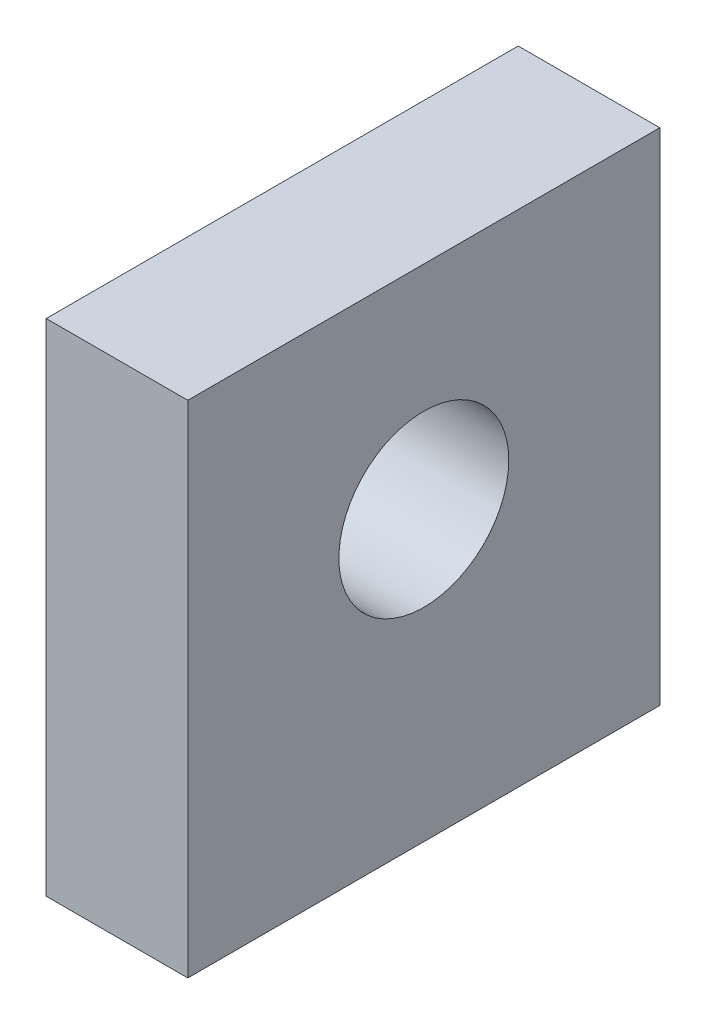
ISO-10303-21;
HEADER;
FILE_DESCRIPTION(('STEP AP214'),'2;1');
FILE_NAME('part.step','',(''),(''),'','','');
FILE_SCHEMA(('AUTOMOTIVE_DESIGN { 1 0 10303 214 1 1 1 1 }'));
ENDSEC;
DATA;
#1=APPLICATION_CONTEXT('core data for automotive mechanical design processes');
#2=APPLICATION_PROTOCOL_DEFINITION('international standard','automotive_design',2000,#1);
#3=PRODUCT_CONTEXT('',#1,'mechanical');
#4=PRODUCT('Part','Part','',(#3));
#5=PRODUCT_RELATED_PRODUCT_CATEGORY('part','',(#4));
#6=PRODUCT_DEFINITION_FORMATION('','',#4);
#7=PRODUCT_DEFINITION_CONTEXT('part definition',#1,'design');
#8=PRODUCT_DEFINITION('design','',#6,#7);
#9=PRODUCT_DEFINITION_SHAPE('','',#8);
#10=(LENGTH_UNIT() NAMED_UNIT(*) SI_UNIT(.MILLI.,.METRE.));
#11=(NAMED_UNIT(*) PLANE_ANGLE_UNIT() SI_UNIT($,.RADIAN.));
#12=(NAMED_UNIT(*) SI_UNIT($,.STERADIAN.) SOLID_ANGLE_UNIT());
#13=UNCERTAINTY_MEASURE_WITH_UNIT(LENGTH_MEASURE(1.E-05),#10,'distance_accuracy_value','');
#14=(GEOMETRIC_REPRESENTATION_CONTEXT(3) GLOBAL_UNCERTAINTY_ASSIGNED_CONTEXT((#13)) GLOBAL_UNIT_ASSIGNED_CONTEXT((#10,
#11,#12)) REPRESENTATION_CONTEXT('',''));
#15=CARTESIAN_POINT('',(0.,0.,0.));
#16=DIRECTION('',(0.,0.,1.));
#17=DIRECTION('',(1.,0.,0.));
#18=AXIS2_PLACEMENT_3D('',#15,#16,#17);
#19=CARTESIAN_POINT('',(15.,0.,0.));
#20=DIRECTION('',(-1.,0.,0.));
#21=DIRECTION('',(0.,0.,1.));
#22=AXIS2_PLACEMENT_3D('',#19,#20,#21);
#23=PLANE('',#22);
#24=DIRECTION('',(0.,1.,0.));
#25=VECTOR('',#24,1.);
#26=CARTESIAN_POINT('',(15.,-26.5,-25.));
#27=LINE('',#26,#25);
#28=CARTESIAN_POINT('',(15.,-26.5,-25.));
#29=VERTEX_POINT('',#28);
#30=CARTESIAN_POINT('',(15.,26.5,-25.));
#31=VERTEX_POINT('',#30);
#32=EDGE_CURVE('E85',#29,#31,#27,.T.);
#33=ORIENTED_EDGE('',*,*,#32,.T.);
#34=DIRECTION('',(0.,0.,1.));
#35=VECTOR('',#34,1.);
#36=CARTESIAN_POINT('',(15.,26.5,25.));
#37=LINE('',#36,#35);
#38=CARTESIAN_POINT('',(15.,26.5,25.));
#39=VERTEX_POINT('',#38);
#40=EDGE_CURVE('E80',#31,#39,#37,.T.);
#41=ORIENTED_EDGE('',*,*,#40,.T.);
#42=DIRECTION('',(0.,-1.,0.));
#43=VECTOR('',#42,1.);
#44=CARTESIAN_POINT('',(15.,-26.5,25.));
#45=LINE('',#44,#43);
#46=CARTESIAN_POINT('',(15.,-26.5,25.));
#47=VERTEX_POINT('',#46);
#48=EDGE_CURVE('E83',#39,#47,#45,.T.);
#49=ORIENTED_EDGE('',*,*,#48,.T.);
#50=DIRECTION('',(0.,0.,-1.));
#51=VECTOR('',#50,1.);
#52=CARTESIAN_POINT('',(15.,-26.5,25.));
#53=LINE('',#52,#51);
#54=EDGE_CURVE('E50',#47,#29,#53,.T.);
#55=ORIENTED_EDGE('',*,*,#54,.T.);
#56=EDGE_LOOP('',(#33,#41,#49,#55));
#57=FACE_BOUND('',#56,.T.);
#58=CARTESIAN_POINT('',(15.,4.,0.));
#59=DIRECTION('',(1.,0.,0.));
#60=DIRECTION('',(0.,0.,-1.));
#61=AXIS2_PLACEMENT_3D('',#58,#59,#60);
#62=CIRCLE('',#61,9.);
#63=CARTESIAN_POINT('',(15.,4.,-9.));
#64=VERTEX_POINT('',#63);
#65=EDGE_CURVE('E100',#64,#64,#62,.T.);
#66=ORIENTED_EDGE('',*,*,#65,.F.);
#67=EDGE_LOOP('',(#66));
#68=FACE_BOUND('',#67,.T.);
#69=ADVANCED_FACE('F33',(#57,#68),#23,.F.);
#70=CARTESIAN_POINT('',(0.,0.,0.));
#71=DIRECTION('',(-1.,0.,0.));
#72=DIRECTION('',(0.,0.,1.));
#73=AXIS2_PLACEMENT_3D('',#70,#71,#72);
#74=PLANE('',#73);
#75=DIRECTION('',(0.,1.,0.));
#76=VECTOR('',#75,1.);
#77=CARTESIAN_POINT('',(0.,-26.5,-25.));
#78=LINE('',#77,#76);
#79=CARTESIAN_POINT('',(0.,-26.5,-25.));
#80=VERTEX_POINT('',#79);
#81=CARTESIAN_POINT('',(0.,26.5,-25.));
#82=VERTEX_POINT('',#81);
#83=EDGE_CURVE('E97',#80,#82,#78,.T.);
#84=ORIENTED_EDGE('',*,*,#83,.F.);
#85=DIRECTION('',(0.,0.,-1.));
#86=VECTOR('',#85,1.);
#87=CARTESIAN_POINT('',(0.,-26.5,25.));
#88=LINE('',#87,#86);
#89=CARTESIAN_POINT('',(0.,-26.5,25.));
#90=VERTEX_POINT('',#89);
#91=EDGE_CURVE('E73',#90,#80,#88,.T.);
#92=ORIENTED_EDGE('',*,*,#91,.F.);
#93=DIRECTION('',(0.,-1.,0.));
#94=VECTOR('',#93,1.);
#95=CARTESIAN_POINT('',(0.,-26.5,25.));
#96=LINE('',#95,#94);
#97=CARTESIAN_POINT('',(0.,26.5,25.));
#98=VERTEX_POINT('',#97);
#99=EDGE_CURVE('E67',#98,#90,#96,.T.);
#100=ORIENTED_EDGE('',*,*,#99,.F.);
#101=DIRECTION('',(0.,0.,1.));
#102=VECTOR('',#101,1.);
#103=CARTESIAN_POINT('',(0.,26.5,25.));
#104=LINE('',#103,#102);
#105=EDGE_CURVE('E89',#82,#98,#104,.T.);
#106=ORIENTED_EDGE('',*,*,#105,.F.);
#107=EDGE_LOOP('',(#84,#92,#100,#106));
#108=FACE_BOUND('',#107,.T.);
#109=CARTESIAN_POINT('',(0.,4.,0.));
#110=DIRECTION('',(1.,0.,0.));
#111=DIRECTION('',(0.,0.,-1.));
#112=AXIS2_PLACEMENT_3D('',#109,#110,#111);
#113=CIRCLE('',#112,9.);
#114=CARTESIAN_POINT('',(0.,4.,-9.));
#115=VERTEX_POINT('',#114);
#116=EDGE_CURVE('E112',#115,#115,#113,.T.);
#117=ORIENTED_EDGE('',*,*,#116,.T.);
#118=EDGE_LOOP('',(#117));
#119=FACE_BOUND('',#118,.T.);
#120=ADVANCED_FACE('F108',(#108,#119),#74,.T.);
#121=CARTESIAN_POINT('',(15.,-26.5,-25.));
#122=DIRECTION('',(0.,0.,1.));
#123=DIRECTION('',(1.,0.,0.));
#124=AXIS2_PLACEMENT_3D('',#121,#122,#123);
#125=PLANE('',#124);
#126=ORIENTED_EDGE('',*,*,#83,.T.);
#127=DIRECTION('',(-1.,0.,0.));
#128=VECTOR('',#127,1.);
#129=CARTESIAN_POINT('',(15.,26.5,-25.));
#130=LINE('',#129,#128);
#131=EDGE_CURVE('E11',#31,#82,#130,.T.);
#132=ORIENTED_EDGE('',*,*,#131,.F.);
#133=ORIENTED_EDGE('',*,*,#32,.F.);
#134=DIRECTION('',(-1.,0.,0.));
#135=VECTOR('',#134,1.);
#136=CARTESIAN_POINT('',(15.,-26.5,-25.));
#137=LINE('',#136,#135);
#138=EDGE_CURVE('E93',#29,#80,#137,.T.);
#139=ORIENTED_EDGE('',*,*,#138,.T.);
#140=EDGE_LOOP('',(#126,#132,#133,#139));
#141=FACE_BOUND('',#140,.T.);
#142=ADVANCED_FACE('F35',(#141),#125,.F.);
#143=CARTESIAN_POINT('',(15.,26.5,25.));
#144=DIRECTION('',(0.,-1.,0.));
#145=DIRECTION('',(0.,0.,-1.));
#146=AXIS2_PLACEMENT_3D('',#143,#144,#145);
#147=PLANE('',#146);
#148=ORIENTED_EDGE('',*,*,#105,.T.);
#149=DIRECTION('',(-1.,0.,0.));
#150=VECTOR('',#149,1.);
#151=CARTESIAN_POINT('',(15.,26.5,25.));
#152=LINE('',#151,#150);
#153=EDGE_CURVE('E42',#39,#98,#152,.T.);
#154=ORIENTED_EDGE('',*,*,#153,.F.);
#155=ORIENTED_EDGE('',*,*,#40,.F.);
#156=ORIENTED_EDGE('',*,*,#131,.T.);
#157=EDGE_LOOP('',(#148,#154,#155,#156));
#158=FACE_BOUND('',#157,.T.);
#159=ADVANCED_FACE('F88',(#158),#147,.F.);
#160=CARTESIAN_POINT('',(15.,-26.5,25.));
#161=DIRECTION('',(0.,0.,-1.));
#162=DIRECTION('',(-1.,0.,0.));
#163=AXIS2_PLACEMENT_3D('',#160,#161,#162);
#164=PLANE('',#163);
#165=ORIENTED_EDGE('',*,*,#99,.T.);
#166=DIRECTION('',(-1.,0.,0.));
#167=VECTOR('',#166,1.);
#168=CARTESIAN_POINT('',(15.,-26.5,25.));
#169=LINE('',#168,#167);
#170=EDGE_CURVE('E90',#47,#90,#169,.T.);
#171=ORIENTED_EDGE('',*,*,#170,.F.);
#172=ORIENTED_EDGE('',*,*,#48,.F.);
#173=ORIENTED_EDGE('',*,*,#153,.T.);
#174=EDGE_LOOP('',(#165,#171,#172,#173));
#175=FACE_BOUND('',#174,.T.);
#176=ADVANCED_FACE('F91',(#175),#164,.F.);
#177=CARTESIAN_POINT('',(15.,-26.5,25.));
#178=DIRECTION('',(0.,1.,0.));
#179=DIRECTION('',(0.,0.,1.));
#180=AXIS2_PLACEMENT_3D('',#177,#178,#179);
#181=PLANE('',#180);
#182=ORIENTED_EDGE('',*,*,#91,.T.);
#183=ORIENTED_EDGE('',*,*,#138,.F.);
#184=ORIENTED_EDGE('',*,*,#54,.F.);
#185=ORIENTED_EDGE('',*,*,#170,.T.);
#186=EDGE_LOOP('',(#182,#183,#184,#185));
#187=FACE_BOUND('',#186,.T.);
#188=ADVANCED_FACE('F105',(#187),#181,.F.);
#189=CARTESIAN_POINT('',(15.,4.,0.));
#190=DIRECTION('',(-1.,0.,0.));
#191=DIRECTION('',(0.,0.,1.));
#192=AXIS2_PLACEMENT_3D('',#189,#190,#191);
#193=CYLINDRICAL_SURFACE('',#192,9.);
#194=ORIENTED_EDGE('',*,*,#65,.T.);
#195=EDGE_LOOP('',(#194));
#196=FACE_BOUND('',#195,.T.);
#197=ORIENTED_EDGE('',*,*,#116,.F.);
#198=EDGE_LOOP('',(#197));
#199=FACE_BOUND('',#198,.T.);
#200=ADVANCED_FACE('F118',(#196,#199),#193,.F.);
#201=CLOSED_SHELL('',(#69,#120,#142,#159,#176,#188,#200));
#202=MANIFOLD_SOLID_BREP('B2',#201);
#203=ADVANCED_BREP_SHAPE_REPRESENTATION('',(#18,#202),#14);
#204=SHAPE_DEFINITION_REPRESENTATION(#9,#203);
ENDSEC;
END-ISO-10303-21;
